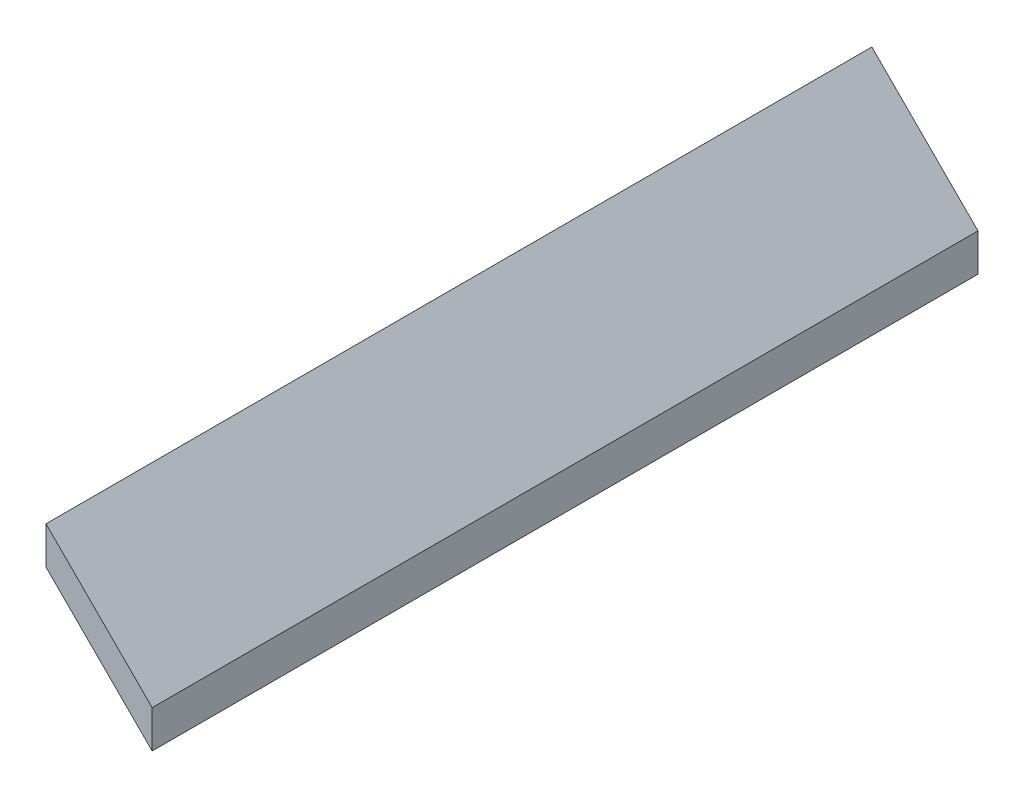
ISO-10303-21;
HEADER;
FILE_DESCRIPTION(('STEP AP214'),'2;1');
FILE_NAME('part.step','',(''),(''),'','','');
FILE_SCHEMA(('AUTOMOTIVE_DESIGN { 1 0 10303 214 1 1 1 1 }'));
ENDSEC;
DATA;
#1=APPLICATION_CONTEXT('core data for automotive mechanical design processes');
#2=APPLICATION_PROTOCOL_DEFINITION('international standard','automotive_design',2000,#1);
#3=PRODUCT_CONTEXT('',#1,'mechanical');
#4=PRODUCT('Part','Part','',(#3));
#5=PRODUCT_RELATED_PRODUCT_CATEGORY('part','',(#4));
#6=PRODUCT_DEFINITION_FORMATION('','',#4);
#7=PRODUCT_DEFINITION_CONTEXT('part definition',#1,'design');
#8=PRODUCT_DEFINITION('design','',#6,#7);
#9=PRODUCT_DEFINITION_SHAPE('','',#8);
#10=(LENGTH_UNIT() NAMED_UNIT(*) SI_UNIT(.MILLI.,.METRE.));
#11=(NAMED_UNIT(*) PLANE_ANGLE_UNIT() SI_UNIT($,.RADIAN.));
#12=(NAMED_UNIT(*) SI_UNIT($,.STERADIAN.) SOLID_ANGLE_UNIT());
#13=UNCERTAINTY_MEASURE_WITH_UNIT(LENGTH_MEASURE(1.E-05),#10,'distance_accuracy_value','');
#14=(GEOMETRIC_REPRESENTATION_CONTEXT(3) GLOBAL_UNCERTAINTY_ASSIGNED_CONTEXT((#13)) GLOBAL_UNIT_ASSIGNED_CONTEXT((#10,
#11,#12)) REPRESENTATION_CONTEXT('',''));
#15=CARTESIAN_POINT('',(0.,0.,0.));
#16=DIRECTION('',(0.,0.,1.));
#17=DIRECTION('',(1.,0.,0.));
#18=AXIS2_PLACEMENT_3D('',#15,#16,#17);
#19=CARTESIAN_POINT('',(-35.9210244842768,35.9210244842764,279.4));
#20=DIRECTION('',(0.707106781186544,0.707106781186552,0.));
#21=DIRECTION('',(-0.707106781186552,0.707106781186544,0.));
#22=AXIS2_PLACEMENT_3D('',#19,#20,#21);
#23=PLANE('',#22);
#24=DIRECTION('',(0.707106781186551,-0.707106781186544,0.));
#25=VECTOR('',#24,1.);
#26=CARTESIAN_POINT('',(-35.9210244842768,35.9210244842764,0.));
#27=LINE('',#26,#25);
#28=CARTESIAN_POINT('',(-35.9210244842768,35.9210244842764,0.));
#29=VERTEX_POINT('',#28);
#30=CARTESIAN_POINT('',(0.,0.,0.));
#31=VERTEX_POINT('',#30);
#32=EDGE_CURVE('E96',#29,#31,#27,.T.);
#33=ORIENTED_EDGE('',*,*,#32,.T.);
#34=DIRECTION('',(0.,0.,-1.));
#35=VECTOR('',#34,1.);
#36=CARTESIAN_POINT('',(0.,0.,279.4));
#37=LINE('',#36,#35);
#38=CARTESIAN_POINT('',(0.,0.,279.4));
#39=VERTEX_POINT('',#38);
#40=EDGE_CURVE('E11',#39,#31,#37,.T.);
#41=ORIENTED_EDGE('',*,*,#40,.F.);
#42=DIRECTION('',(0.707106781186551,-0.707106781186544,0.));
#43=VECTOR('',#42,1.);
#44=CARTESIAN_POINT('',(-35.9210244842768,35.9210244842764,279.4));
#45=LINE('',#44,#43);
#46=CARTESIAN_POINT('',(-35.9210244842768,35.9210244842764,279.4));
#47=VERTEX_POINT('',#46);
#48=EDGE_CURVE('E84',#47,#39,#45,.T.);
#49=ORIENTED_EDGE('',*,*,#48,.F.);
#50=DIRECTION('',(0.,0.,-1.));
#51=VECTOR('',#50,1.);
#52=CARTESIAN_POINT('',(-35.9210244842768,35.9210244842764,279.4));
#53=LINE('',#52,#51);
#54=EDGE_CURVE('E92',#47,#29,#53,.T.);
#55=ORIENTED_EDGE('',*,*,#54,.T.);
#56=EDGE_LOOP('',(#33,#41,#49,#55));
#57=FACE_BOUND('',#56,.T.);
#58=ADVANCED_FACE('F33',(#57),#23,.F.);
#59=CARTESIAN_POINT('',(0.,0.,279.4));
#60=DIRECTION('',(-1.,0.,0.));
#61=DIRECTION('',(0.,0.,1.));
#62=AXIS2_PLACEMENT_3D('',#59,#60,#61);
#63=PLANE('',#62);
#64=DIRECTION('',(0.,1.,0.));
#65=VECTOR('',#64,1.);
#66=CARTESIAN_POINT('',(0.,0.,0.));
#67=LINE('',#66,#65);
#68=CARTESIAN_POINT('',(0.,12.7,0.));
#69=VERTEX_POINT('',#68);
#70=EDGE_CURVE('E88',#31,#69,#67,.T.);
#71=ORIENTED_EDGE('',*,*,#70,.T.);
#72=DIRECTION('',(0.,0.,-1.));
#73=VECTOR('',#72,1.);
#74=CARTESIAN_POINT('',(0.,12.7,279.4));
#75=LINE('',#74,#73);
#76=CARTESIAN_POINT('',(0.,12.7,279.4));
#77=VERTEX_POINT('',#76);
#78=EDGE_CURVE('E41',#77,#69,#75,.T.);
#79=ORIENTED_EDGE('',*,*,#78,.F.);
#80=DIRECTION('',(0.,1.,0.));
#81=VECTOR('',#80,1.);
#82=CARTESIAN_POINT('',(0.,0.,279.4));
#83=LINE('',#82,#81);
#84=EDGE_CURVE('E79',#39,#77,#83,.T.);
#85=ORIENTED_EDGE('',*,*,#84,.F.);
#86=ORIENTED_EDGE('',*,*,#40,.T.);
#87=EDGE_LOOP('',(#71,#79,#85,#86));
#88=FACE_BOUND('',#87,.T.);
#89=ADVANCED_FACE('F87',(#88),#63,.F.);
#90=CARTESIAN_POINT('',(0.,12.7,279.4));
#91=DIRECTION('',(-0.707106781186544,-0.707106781186552,0.));
#92=DIRECTION('',(0.707106781186552,-0.707106781186544,0.));
#93=AXIS2_PLACEMENT_3D('',#90,#91,#92);
#94=PLANE('',#93);
#95=DIRECTION('',(-0.707106781186551,0.707106781186544,0.));
#96=VECTOR('',#95,1.);
#97=CARTESIAN_POINT('',(0.,12.7,0.));
#98=LINE('',#97,#96);
#99=CARTESIAN_POINT('',(-35.9210244842768,48.6210244842764,0.));
#100=VERTEX_POINT('',#99);
#101=EDGE_CURVE('E66',#69,#100,#98,.T.);
#102=ORIENTED_EDGE('',*,*,#101,.T.);
#103=DIRECTION('',(0.,0.,-1.));
#104=VECTOR('',#103,1.);
#105=CARTESIAN_POINT('',(-35.9210244842768,48.6210244842764,279.4));
#106=LINE('',#105,#104);
#107=CARTESIAN_POINT('',(-35.9210244842768,48.6210244842764,279.4));
#108=VERTEX_POINT('',#107);
#109=EDGE_CURVE('E89',#108,#100,#106,.T.);
#110=ORIENTED_EDGE('',*,*,#109,.F.);
#111=DIRECTION('',(-0.707106781186551,0.707106781186544,0.));
#112=VECTOR('',#111,1.);
#113=CARTESIAN_POINT('',(0.,12.7,279.4));
#114=LINE('',#113,#112);
#115=EDGE_CURVE('E82',#77,#108,#114,.T.);
#116=ORIENTED_EDGE('',*,*,#115,.F.);
#117=ORIENTED_EDGE('',*,*,#78,.T.);
#118=EDGE_LOOP('',(#102,#110,#116,#117));
#119=FACE_BOUND('',#118,.T.);
#120=ADVANCED_FACE('F90',(#119),#94,.F.);
#121=CARTESIAN_POINT('',(-35.9210244842768,48.6210244842764,279.4));
#122=DIRECTION('',(1.,0.,0.));
#123=DIRECTION('',(0.,0.,-1.));
#124=AXIS2_PLACEMENT_3D('',#121,#122,#123);
#125=PLANE('',#124);
#126=DIRECTION('',(0.,-1.,0.));
#127=VECTOR('',#126,1.);
#128=CARTESIAN_POINT('',(-35.9210244842768,48.6210244842764,0.));
#129=LINE('',#128,#127);
#130=EDGE_CURVE('E72',#100,#29,#129,.T.);
#131=ORIENTED_EDGE('',*,*,#130,.T.);
#132=ORIENTED_EDGE('',*,*,#54,.F.);
#133=DIRECTION('',(0.,-1.,0.));
#134=VECTOR('',#133,1.);
#135=CARTESIAN_POINT('',(-35.9210244842768,48.6210244842764,279.4));
#136=LINE('',#135,#134);
#137=EDGE_CURVE('E49',#108,#47,#136,.T.);
#138=ORIENTED_EDGE('',*,*,#137,.F.);
#139=ORIENTED_EDGE('',*,*,#109,.T.);
#140=EDGE_LOOP('',(#131,#132,#138,#139));
#141=FACE_BOUND('',#140,.T.);
#142=ADVANCED_FACE('F103',(#141),#125,.F.);
#143=CARTESIAN_POINT('',(0.,0.,279.4));
#144=DIRECTION('',(0.,0.,1.));
#145=DIRECTION('',(1.,0.,0.));
#146=AXIS2_PLACEMENT_3D('',#143,#144,#145);
#147=PLANE('',#146);
#148=ORIENTED_EDGE('',*,*,#48,.T.);
#149=ORIENTED_EDGE('',*,*,#84,.T.);
#150=ORIENTED_EDGE('',*,*,#115,.T.);
#151=ORIENTED_EDGE('',*,*,#137,.T.);
#152=EDGE_LOOP('',(#148,#149,#150,#151));
#153=FACE_BOUND('',#152,.T.);
#154=ADVANCED_FACE('F80',(#153),#147,.T.);
#155=CARTESIAN_POINT('',(0.,0.,0.));
#156=DIRECTION('',(0.,0.,1.));
#157=DIRECTION('',(1.,0.,0.));
#158=AXIS2_PLACEMENT_3D('',#155,#156,#157);
#159=PLANE('',#158);
#160=ORIENTED_EDGE('',*,*,#32,.F.);
#161=ORIENTED_EDGE('',*,*,#130,.F.);
#162=ORIENTED_EDGE('',*,*,#101,.F.);
#163=ORIENTED_EDGE('',*,*,#70,.F.);
#164=EDGE_LOOP('',(#160,#161,#162,#163));
#165=FACE_BOUND('',#164,.T.);
#166=ADVANCED_FACE('F106',(#165),#159,.F.);
#167=CLOSED_SHELL('',(#58,#89,#120,#142,#154,#166));
#168=MANIFOLD_SOLID_BREP('B2',#167);
#169=ADVANCED_BREP_SHAPE_REPRESENTATION('',(#18,#168),#14);
#170=SHAPE_DEFINITION_REPRESENTATION(#9,#169);
ENDSEC;
END-ISO-10303-21;
